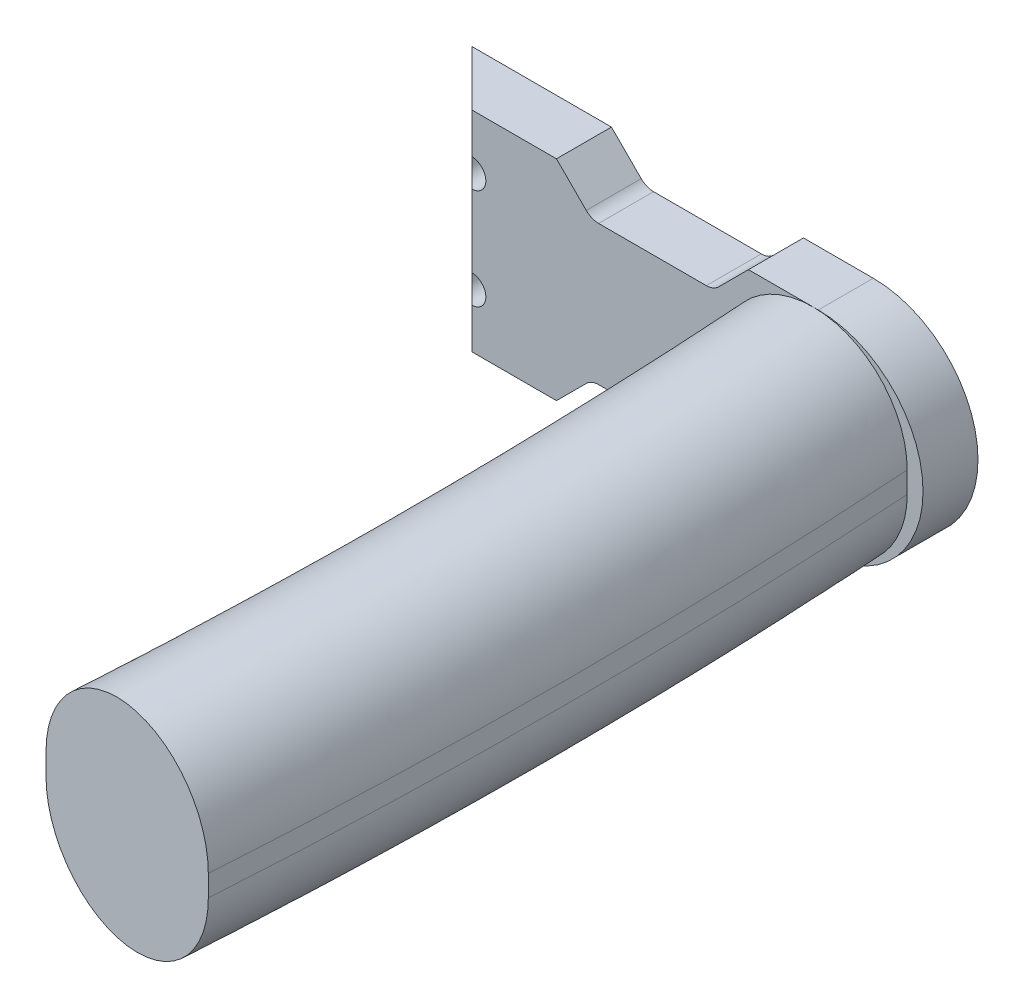
ISO-10303-21;
HEADER;
FILE_DESCRIPTION(('STEP AP214'),'2;1');
FILE_NAME('part.step','',(''),(''),'','','');
FILE_SCHEMA(('AUTOMOTIVE_DESIGN { 1 0 10303 214 1 1 1 1 }'));
ENDSEC;
DATA;
#1=APPLICATION_CONTEXT('core data for automotive mechanical design processes');
#2=APPLICATION_PROTOCOL_DEFINITION('international standard','automotive_design',2000,#1);
#3=PRODUCT_CONTEXT('',#1,'mechanical');
#4=PRODUCT('Part','Part','',(#3));
#5=PRODUCT_RELATED_PRODUCT_CATEGORY('part','',(#4));
#6=PRODUCT_DEFINITION_FORMATION('','',#4);
#7=PRODUCT_DEFINITION_CONTEXT('part definition',#1,'design');
#8=PRODUCT_DEFINITION('design','',#6,#7);
#9=PRODUCT_DEFINITION_SHAPE('','',#8);
#10=(LENGTH_UNIT() NAMED_UNIT(*) SI_UNIT(.MILLI.,.METRE.));
#11=(NAMED_UNIT(*) PLANE_ANGLE_UNIT() SI_UNIT($,.RADIAN.));
#12=(NAMED_UNIT(*) SI_UNIT($,.STERADIAN.) SOLID_ANGLE_UNIT());
#13=UNCERTAINTY_MEASURE_WITH_UNIT(LENGTH_MEASURE(1.E-05),#10,'distance_accuracy_value','');
#14=(GEOMETRIC_REPRESENTATION_CONTEXT(3) GLOBAL_UNCERTAINTY_ASSIGNED_CONTEXT((#13)) GLOBAL_UNIT_ASSIGNED_CONTEXT((#10,
#11,#12)) REPRESENTATION_CONTEXT('',''));
#15=CARTESIAN_POINT('',(0.,0.,0.));
#16=DIRECTION('',(0.,0.,1.));
#17=DIRECTION('',(1.,0.,0.));
#18=AXIS2_PLACEMENT_3D('',#15,#16,#17);
#19=CARTESIAN_POINT('',(33.0651280605346,15.875,10.));
#20=DIRECTION('',(0.,0.,-1.));
#21=DIRECTION('',(-1.,0.,0.));
#22=AXIS2_PLACEMENT_3D('',#19,#20,#21);
#23=PLANE('',#22);
#24=DIRECTION('',(0.,-1.,0.));
#25=VECTOR('',#24,1.);
#26=CARTESIAN_POINT('',(54.9536455693665,-1.92559775382524,10.));
#27=LINE('',#26,#25);
#28=CARTESIAN_POINT('',(54.9536455693666,1.92559775382546,9.99999999999999));
#29=VERTEX_POINT('',#28);
#30=CARTESIAN_POINT('',(54.9536455693666,-1.92559775382524,9.99999999999999));
#31=VERTEX_POINT('',#30);
#32=EDGE_CURVE('E54',#29,#31,#27,.T.);
#33=ORIENTED_EDGE('',*,*,#32,.F.);
#34=CARTESIAN_POINT('',(72.0780478155412,1.92559775382545,10.));
#35=DIRECTION('',(0.,0.,1.));
#36=DIRECTION('',(1.,0.,0.));
#37=AXIS2_PLACEMENT_3D('',#34,#35,#36);
#38=CIRCLE('',#37,17.1244022461747);
#39=CARTESIAN_POINT('',(72.0780478155409,19.0500000000001,10.));
#40=VERTEX_POINT('',#39);
#41=EDGE_CURVE('E11',#40,#29,#38,.T.);
#42=ORIENTED_EDGE('',*,*,#41,.F.);
#43=DIRECTION('',(-1.,0.,0.));
#44=VECTOR('',#43,1.);
#45=CARTESIAN_POINT('',(73.025,19.0500000000001,10.));
#46=LINE('',#45,#44);
#47=CARTESIAN_POINT('',(60.325,19.0499999999999,10.));
#48=VERTEX_POINT('',#47);
#49=EDGE_CURVE('E260',#40,#48,#46,.T.);
#50=ORIENTED_EDGE('',*,*,#49,.T.);
#51=DIRECTION('',(-0.707106781186546,-0.707106781186549,0.));
#52=VECTOR('',#51,1.);
#53=CARTESIAN_POINT('',(54.9049359697328,13.6299359697327,10.));
#54=LINE('',#53,#52);
#55=CARTESIAN_POINT('',(54.9049359697328,13.6299359697327,10.));
#56=VERTEX_POINT('',#55);
#57=EDGE_CURVE('E264',#48,#56,#54,.T.);
#58=ORIENTED_EDGE('',*,*,#57,.T.);
#59=CARTESIAN_POINT('',(52.6598719394655,15.875,10.));
#60=DIRECTION('',(0.,0.,-1.));
#61=DIRECTION('',(-1.,0.,0.));
#62=AXIS2_PLACEMENT_3D('',#59,#60,#61);
#63=CIRCLE('',#62,3.175);
#64=CARTESIAN_POINT('',(52.6598719394655,12.7,10.));
#65=VERTEX_POINT('',#64);
#66=EDGE_CURVE('E266',#56,#65,#63,.T.);
#67=ORIENTED_EDGE('',*,*,#66,.T.);
#68=DIRECTION('',(-1.,0.,0.));
#69=VECTOR('',#68,1.);
#70=CARTESIAN_POINT('',(33.0651280605346,12.7,10.));
#71=LINE('',#70,#69);
#72=CARTESIAN_POINT('',(33.0651280605346,12.7,10.));
#73=VERTEX_POINT('',#72);
#74=EDGE_CURVE('E268',#65,#73,#71,.T.);
#75=ORIENTED_EDGE('',*,*,#74,.T.);
#76=CARTESIAN_POINT('',(33.0651280605346,15.875,10.));
#77=DIRECTION('',(0.,0.,-1.));
#78=DIRECTION('',(-1.,0.,0.));
#79=AXIS2_PLACEMENT_3D('',#76,#77,#78);
#80=CIRCLE('',#79,3.175);
#81=CARTESIAN_POINT('',(30.8200640302673,13.6299359697327,10.));
#82=VERTEX_POINT('',#81);
#83=EDGE_CURVE('E270',#73,#82,#80,.T.);
#84=ORIENTED_EDGE('',*,*,#83,.T.);
#85=DIRECTION('',(-0.70710678118655,0.707106781186545,0.));
#86=VECTOR('',#85,1.);
#87=CARTESIAN_POINT('',(25.4,19.05,10.));
#88=LINE('',#87,#86);
#89=CARTESIAN_POINT('',(25.4,19.05,10.));
#90=VERTEX_POINT('',#89);
#91=EDGE_CURVE('E272',#82,#90,#88,.T.);
#92=ORIENTED_EDGE('',*,*,#91,.T.);
#93=DIRECTION('',(-1.,0.,0.));
#94=VECTOR('',#93,1.);
#95=CARTESIAN_POINT('',(0.,19.05,10.));
#96=LINE('',#95,#94);
#97=CARTESIAN_POINT('',(10.,19.05,10.));
#98=VERTEX_POINT('',#97);
#99=EDGE_CURVE('E274',#90,#98,#96,.T.);
#100=ORIENTED_EDGE('',*,*,#99,.T.);
#101=DIRECTION('',(0.,-1.,0.));
#102=VECTOR('',#101,1.);
#103=CARTESIAN_POINT('',(10.,15.875,10.));
#104=LINE('',#103,#102);
#105=CARTESIAN_POINT('',(10.,11.6967,10.));
#106=VERTEX_POINT('',#105);
#107=EDGE_CURVE('E352',#98,#106,#104,.T.);
#108=ORIENTED_EDGE('',*,*,#107,.T.);
#109=CARTESIAN_POINT('',(10.,9.144,10.));
#110=DIRECTION('',(0.,0.,-1.));
#111=DIRECTION('',(-1.,0.,0.));
#112=AXIS2_PLACEMENT_3D('',#109,#110,#111);
#113=CIRCLE('',#112,2.5527);
#114=CARTESIAN_POINT('',(10.,6.5913,10.));
#115=VERTEX_POINT('',#114);
#116=EDGE_CURVE('E40',#106,#115,#113,.T.);
#117=ORIENTED_EDGE('',*,*,#116,.T.);
#118=CARTESIAN_POINT('',(10.,-6.5913,10.));
#119=VERTEX_POINT('',#118);
#120=EDGE_CURVE('E356',#115,#119,#104,.T.);
#121=ORIENTED_EDGE('',*,*,#120,.T.);
#122=CARTESIAN_POINT('',(10.,-9.144,10.));
#123=DIRECTION('',(0.,0.,-1.));
#124=DIRECTION('',(-1.,0.,0.));
#125=AXIS2_PLACEMENT_3D('',#122,#123,#124);
#126=CIRCLE('',#125,2.5527);
#127=CARTESIAN_POINT('',(10.,-11.6967,10.));
#128=VERTEX_POINT('',#127);
#129=EDGE_CURVE('E231',#119,#128,#126,.T.);
#130=ORIENTED_EDGE('',*,*,#129,.T.);
#131=CARTESIAN_POINT('',(10.,-19.05,10.));
#132=VERTEX_POINT('',#131);
#133=EDGE_CURVE('E351',#128,#132,#104,.T.);
#134=ORIENTED_EDGE('',*,*,#133,.T.);
#135=DIRECTION('',(1.,0.,0.));
#136=VECTOR('',#135,1.);
#137=CARTESIAN_POINT('',(25.4,-19.05,10.));
#138=LINE('',#137,#136);
#139=CARTESIAN_POINT('',(25.4,-19.05,10.));
#140=VERTEX_POINT('',#139);
#141=EDGE_CURVE('E242',#132,#140,#138,.T.);
#142=ORIENTED_EDGE('',*,*,#141,.T.);
#143=DIRECTION('',(0.707106781186548,0.707106781186547,0.));
#144=VECTOR('',#143,1.);
#145=CARTESIAN_POINT('',(30.8200640302673,-13.6299359697327,10.));
#146=LINE('',#145,#144);
#147=CARTESIAN_POINT('',(30.8200640302673,-13.6299359697327,10.));
#148=VERTEX_POINT('',#147);
#149=EDGE_CURVE('E244',#140,#148,#146,.T.);
#150=ORIENTED_EDGE('',*,*,#149,.T.);
#151=CARTESIAN_POINT('',(33.0651280605346,-15.875,10.));
#152=DIRECTION('',(0.,0.,-1.));
#153=DIRECTION('',(1.,0.,0.));
#154=AXIS2_PLACEMENT_3D('',#151,#152,#153);
#155=CIRCLE('',#154,3.175);
#156=CARTESIAN_POINT('',(33.0651280605346,-12.7,10.));
#157=VERTEX_POINT('',#156);
#158=EDGE_CURVE('E247',#148,#157,#155,.T.);
#159=ORIENTED_EDGE('',*,*,#158,.T.);
#160=DIRECTION('',(1.,0.,0.));
#161=VECTOR('',#160,1.);
#162=CARTESIAN_POINT('',(52.6598719394655,-12.7,10.));
#163=LINE('',#162,#161);
#164=CARTESIAN_POINT('',(52.6598719394655,-12.7,10.));
#165=VERTEX_POINT('',#164);
#166=EDGE_CURVE('E249',#157,#165,#163,.T.);
#167=ORIENTED_EDGE('',*,*,#166,.T.);
#168=CARTESIAN_POINT('',(52.6598719394655,-15.875,10.));
#169=DIRECTION('',(0.,0.,-1.));
#170=DIRECTION('',(1.,0.,0.));
#171=AXIS2_PLACEMENT_3D('',#168,#169,#170);
#172=CIRCLE('',#171,3.175);
#173=CARTESIAN_POINT('',(54.9049359697327,-13.6299359697327,10.));
#174=VERTEX_POINT('',#173);
#175=EDGE_CURVE('E251',#165,#174,#172,.T.);
#176=ORIENTED_EDGE('',*,*,#175,.T.);
#177=DIRECTION('',(0.707106781186552,-0.707106781186543,0.));
#178=VECTOR('',#177,1.);
#179=CARTESIAN_POINT('',(54.9049359697327,-13.6299359697327,10.));
#180=LINE('',#179,#178);
#181=CARTESIAN_POINT('',(60.325,-19.0499999999999,10.));
#182=VERTEX_POINT('',#181);
#183=EDGE_CURVE('E253',#174,#182,#180,.T.);
#184=ORIENTED_EDGE('',*,*,#183,.T.);
#185=DIRECTION('',(1.,0.,0.));
#186=VECTOR('',#185,1.);
#187=CARTESIAN_POINT('',(73.025,-19.0499999999999,10.));
#188=LINE('',#187,#186);
#189=CARTESIAN_POINT('',(72.0780478155412,-19.0499999999999,10.));
#190=VERTEX_POINT('',#189);
#191=EDGE_CURVE('E256',#182,#190,#188,.T.);
#192=ORIENTED_EDGE('',*,*,#191,.T.);
#193=CARTESIAN_POINT('',(72.0780478155412,-1.92559775382524,10.));
#194=DIRECTION('',(0.,0.,1.));
#195=DIRECTION('',(1.,0.,0.));
#196=AXIS2_PLACEMENT_3D('',#193,#194,#195);
#197=CIRCLE('',#196,17.1244022461747);
#198=EDGE_CURVE('E58',#31,#190,#197,.T.);
#199=ORIENTED_EDGE('',*,*,#198,.F.);
#200=EDGE_LOOP('',(#33,#42,#50,#58,#67,#75,#84,#92,#100,#108,#117,#121,#130,#134,#142,#150,#159,
#167,#176,#184,#192,#199));
#201=FACE_BOUND('',#200,.T.);
#202=ADVANCED_FACE('F36',(#201),#23,.F.);
#203=CARTESIAN_POINT('',(89.2024500617159,-1.92559775382524,10.));
#204=VERTEX_POINT('',#203);
#205=EDGE_CURVE('E45',#190,#204,#197,.T.);
#206=ORIENTED_EDGE('',*,*,#205,.F.);
#207=CARTESIAN_POINT('',(73.025,-19.0499999999999,10.));
#208=VERTEX_POINT('',#207);
#209=EDGE_CURVE('E255',#190,#208,#188,.T.);
#210=ORIENTED_EDGE('',*,*,#209,.T.);
#211=CARTESIAN_POINT('',(73.025,1.11022302462516E-13,10.));
#212=DIRECTION('',(0.,0.,1.));
#213=DIRECTION('',(1.,0.,0.));
#214=AXIS2_PLACEMENT_3D('',#211,#212,#213);
#215=CIRCLE('',#214,19.05);
#216=CARTESIAN_POINT('',(73.025,19.0500000000001,10.));
#217=VERTEX_POINT('',#216);
#218=EDGE_CURVE('E258',#208,#217,#215,.T.);
#219=ORIENTED_EDGE('',*,*,#218,.T.);
#220=EDGE_CURVE('E261',#217,#40,#46,.T.);
#221=ORIENTED_EDGE('',*,*,#220,.T.);
#222=CARTESIAN_POINT('',(89.2024500617159,1.92559775382545,10.));
#223=VERTEX_POINT('',#222);
#224=EDGE_CURVE('E47',#223,#40,#38,.T.);
#225=ORIENTED_EDGE('',*,*,#224,.F.);
#226=DIRECTION('',(0.,1.,0.));
#227=VECTOR('',#226,1.);
#228=CARTESIAN_POINT('',(89.2024500617158,-1.92559775382524,10.));
#229=LINE('',#228,#227);
#230=EDGE_CURVE('E216',#204,#223,#229,.T.);
#231=ORIENTED_EDGE('',*,*,#230,.F.);
#232=EDGE_LOOP('',(#206,#210,#219,#221,#225,#231));
#233=FACE_BOUND('',#232,.T.);
#234=ADVANCED_FACE('F372',(#233),#23,.F.);
#235=CARTESIAN_POINT('',(25.4,-19.05,10.));
#236=DIRECTION('',(0.,1.,0.));
#237=DIRECTION('',(0.,0.,1.));
#238=AXIS2_PLACEMENT_3D('',#235,#236,#237);
#239=PLANE('',#238);
#240=ORIENTED_EDGE('',*,*,#141,.F.);
#241=DIRECTION('',(0.707106781186546,0.,0.707106781186549));
#242=VECTOR('',#241,1.);
#243=CARTESIAN_POINT('',(10.,-19.05,10.));
#244=LINE('',#243,#242);
#245=CARTESIAN_POINT('',(0.,-19.05,0.));
#246=VERTEX_POINT('',#245);
#247=EDGE_CURVE('E355',#132,#246,#244,.F.);
#248=ORIENTED_EDGE('',*,*,#247,.T.);
#249=DIRECTION('',(1.,0.,0.));
#250=VECTOR('',#249,1.);
#251=CARTESIAN_POINT('',(25.4,-19.05,0.));
#252=LINE('',#251,#250);
#253=CARTESIAN_POINT('',(25.4,-19.05,0.));
#254=VERTEX_POINT('',#253);
#255=EDGE_CURVE('E241',#246,#254,#252,.T.);
#256=ORIENTED_EDGE('',*,*,#255,.T.);
#257=DIRECTION('',(0.,0.,-1.));
#258=VECTOR('',#257,1.);
#259=CARTESIAN_POINT('',(25.4,-19.05,10.));
#260=LINE('',#259,#258);
#261=EDGE_CURVE('E348',#140,#254,#260,.T.);
#262=ORIENTED_EDGE('',*,*,#261,.F.);
#263=EDGE_LOOP('',(#240,#248,#256,#262));
#264=FACE_BOUND('',#263,.T.);
#265=ADVANCED_FACE('F433',(#264),#239,.F.);
#266=CARTESIAN_POINT('',(30.8200640302673,-13.6299359697327,10.));
#267=DIRECTION('',(-0.707106781186547,0.707106781186548,0.));
#268=DIRECTION('',(-0.707106781186548,-0.707106781186547,0.));
#269=AXIS2_PLACEMENT_3D('',#266,#267,#268);
#270=PLANE('',#269);
#271=DIRECTION('',(0.707106781186548,0.707106781186547,0.));
#272=VECTOR('',#271,1.);
#273=CARTESIAN_POINT('',(30.8200640302673,-13.6299359697327,0.));
#274=LINE('',#273,#272);
#275=CARTESIAN_POINT('',(30.8200640302673,-13.6299359697327,0.));
#276=VERTEX_POINT('',#275);
#277=EDGE_CURVE('E280',#254,#276,#274,.T.);
#278=ORIENTED_EDGE('',*,*,#277,.T.);
#279=DIRECTION('',(0.,0.,-1.));
#280=VECTOR('',#279,1.);
#281=CARTESIAN_POINT('',(30.8200640302673,-13.6299359697327,10.));
#282=LINE('',#281,#280);
#283=EDGE_CURVE('E345',#148,#276,#282,.T.);
#284=ORIENTED_EDGE('',*,*,#283,.F.);
#285=ORIENTED_EDGE('',*,*,#149,.F.);
#286=ORIENTED_EDGE('',*,*,#261,.T.);
#287=EDGE_LOOP('',(#278,#284,#285,#286));
#288=FACE_BOUND('',#287,.T.);
#289=ADVANCED_FACE('F437',(#288),#270,.F.);
#290=CARTESIAN_POINT('',(33.0651280605346,-15.875,10.));
#291=DIRECTION('',(0.,0.,-1.));
#292=DIRECTION('',(-1.,0.,0.));
#293=AXIS2_PLACEMENT_3D('',#290,#291,#292);
#294=CYLINDRICAL_SURFACE('',#293,3.175);
#295=CARTESIAN_POINT('',(33.0651280605346,-15.875,0.));
#296=DIRECTION('',(0.,0.,-1.));
#297=DIRECTION('',(1.,0.,0.));
#298=AXIS2_PLACEMENT_3D('',#295,#296,#297);
#299=CIRCLE('',#298,3.175);
#300=CARTESIAN_POINT('',(33.0651280605346,-12.7,0.));
#301=VERTEX_POINT('',#300);
#302=EDGE_CURVE('E282',#276,#301,#299,.T.);
#303=ORIENTED_EDGE('',*,*,#302,.T.);
#304=DIRECTION('',(0.,0.,-1.));
#305=VECTOR('',#304,1.);
#306=CARTESIAN_POINT('',(33.0651280605346,-12.7,10.));
#307=LINE('',#306,#305);
#308=EDGE_CURVE('E342',#157,#301,#307,.T.);
#309=ORIENTED_EDGE('',*,*,#308,.F.);
#310=ORIENTED_EDGE('',*,*,#158,.F.);
#311=ORIENTED_EDGE('',*,*,#283,.T.);
#312=EDGE_LOOP('',(#303,#309,#310,#311));
#313=FACE_BOUND('',#312,.T.);
#314=ADVANCED_FACE('F441',(#313),#294,.F.);
#315=CARTESIAN_POINT('',(52.6598719394655,-12.7,10.));
#316=DIRECTION('',(0.,1.,0.));
#317=DIRECTION('',(-1.,0.,0.));
#318=AXIS2_PLACEMENT_3D('',#315,#316,#317);
#319=PLANE('',#318);
#320=DIRECTION('',(1.,0.,0.));
#321=VECTOR('',#320,1.);
#322=CARTESIAN_POINT('',(52.6598719394655,-12.7,0.));
#323=LINE('',#322,#321);
#324=CARTESIAN_POINT('',(52.6598719394655,-12.7,0.));
#325=VERTEX_POINT('',#324);
#326=EDGE_CURVE('E284',#301,#325,#323,.T.);
#327=ORIENTED_EDGE('',*,*,#326,.T.);
#328=DIRECTION('',(0.,0.,-1.));
#329=VECTOR('',#328,1.);
#330=CARTESIAN_POINT('',(52.6598719394655,-12.7,10.));
#331=LINE('',#330,#329);
#332=EDGE_CURVE('E339',#165,#325,#331,.T.);
#333=ORIENTED_EDGE('',*,*,#332,.F.);
#334=ORIENTED_EDGE('',*,*,#166,.F.);
#335=ORIENTED_EDGE('',*,*,#308,.T.);
#336=EDGE_LOOP('',(#327,#333,#334,#335));
#337=FACE_BOUND('',#336,.T.);
#338=ADVANCED_FACE('F447',(#337),#319,.F.);
#339=CARTESIAN_POINT('',(52.6598719394655,-15.875,10.));
#340=DIRECTION('',(0.,0.,-1.));
#341=DIRECTION('',(-1.,0.,0.));
#342=AXIS2_PLACEMENT_3D('',#339,#340,#341);
#343=CYLINDRICAL_SURFACE('',#342,3.175);
#344=CARTESIAN_POINT('',(52.6598719394655,-15.875,0.));
#345=DIRECTION('',(0.,0.,-1.));
#346=DIRECTION('',(1.,0.,0.));
#347=AXIS2_PLACEMENT_3D('',#344,#345,#346);
#348=CIRCLE('',#347,3.175);
#349=CARTESIAN_POINT('',(54.9049359697327,-13.6299359697327,0.));
#350=VERTEX_POINT('',#349);
#351=EDGE_CURVE('E286',#325,#350,#348,.T.);
#352=ORIENTED_EDGE('',*,*,#351,.T.);
#353=DIRECTION('',(0.,0.,-1.));
#354=VECTOR('',#353,1.);
#355=CARTESIAN_POINT('',(54.9049359697327,-13.6299359697327,10.));
#356=LINE('',#355,#354);
#357=EDGE_CURVE('E336',#174,#350,#356,.T.);
#358=ORIENTED_EDGE('',*,*,#357,.F.);
#359=ORIENTED_EDGE('',*,*,#175,.F.);
#360=ORIENTED_EDGE('',*,*,#332,.T.);
#361=EDGE_LOOP('',(#352,#358,#359,#360));
#362=FACE_BOUND('',#361,.T.);
#363=ADVANCED_FACE('F451',(#362),#343,.F.);
#364=CARTESIAN_POINT('',(54.9049359697327,-13.6299359697327,10.));
#365=DIRECTION('',(0.707106781186543,0.707106781186552,0.));
#366=DIRECTION('',(-0.707106781186552,0.707106781186543,0.));
#367=AXIS2_PLACEMENT_3D('',#364,#365,#366);
#368=PLANE('',#367);
#369=DIRECTION('',(0.707106781186552,-0.707106781186543,0.));
#370=VECTOR('',#369,1.);
#371=CARTESIAN_POINT('',(54.9049359697327,-13.6299359697327,0.));
#372=LINE('',#371,#370);
#373=CARTESIAN_POINT('',(60.325,-19.0499999999999,0.));
#374=VERTEX_POINT('',#373);
#375=EDGE_CURVE('E288',#350,#374,#372,.T.);
#376=ORIENTED_EDGE('',*,*,#375,.T.);
#377=DIRECTION('',(0.,0.,-1.));
#378=VECTOR('',#377,1.);
#379=CARTESIAN_POINT('',(60.325,-19.0499999999999,10.));
#380=LINE('',#379,#378);
#381=EDGE_CURVE('E333',#182,#374,#380,.T.);
#382=ORIENTED_EDGE('',*,*,#381,.F.);
#383=ORIENTED_EDGE('',*,*,#183,.F.);
#384=ORIENTED_EDGE('',*,*,#357,.T.);
#385=EDGE_LOOP('',(#376,#382,#383,#384));
#386=FACE_BOUND('',#385,.T.);
#387=ADVANCED_FACE('F456',(#386),#368,.F.);
#388=CARTESIAN_POINT('',(73.025,-19.0499999999999,10.));
#389=DIRECTION('',(0.,1.,0.));
#390=DIRECTION('',(-1.,0.,0.));
#391=AXIS2_PLACEMENT_3D('',#388,#389,#390);
#392=PLANE('',#391);
#393=DIRECTION('',(1.,0.,0.));
#394=VECTOR('',#393,1.);
#395=CARTESIAN_POINT('',(73.025,-19.0499999999999,0.));
#396=LINE('',#395,#394);
#397=CARTESIAN_POINT('',(73.025,-19.0499999999999,0.));
#398=VERTEX_POINT('',#397);
#399=EDGE_CURVE('E290',#374,#398,#396,.T.);
#400=ORIENTED_EDGE('',*,*,#399,.T.);
#401=DIRECTION('',(0.,0.,-1.));
#402=VECTOR('',#401,1.);
#403=CARTESIAN_POINT('',(73.025,-19.0499999999999,10.));
#404=LINE('',#403,#402);
#405=EDGE_CURVE('E330',#208,#398,#404,.T.);
#406=ORIENTED_EDGE('',*,*,#405,.F.);
#407=ORIENTED_EDGE('',*,*,#209,.F.);
#408=ORIENTED_EDGE('',*,*,#191,.F.);
#409=ORIENTED_EDGE('',*,*,#381,.T.);
#410=EDGE_LOOP('',(#400,#406,#407,#408,#409));
#411=FACE_BOUND('',#410,.T.);
#412=ADVANCED_FACE('F459',(#411),#392,.F.);
#413=CARTESIAN_POINT('',(73.025,1.11022302462516E-13,10.));
#414=DIRECTION('',(0.,0.,-1.));
#415=DIRECTION('',(-1.,0.,0.));
#416=AXIS2_PLACEMENT_3D('',#413,#414,#415);
#417=CYLINDRICAL_SURFACE('',#416,19.05);
#418=CARTESIAN_POINT('',(73.025,1.11022302462516E-13,0.));
#419=DIRECTION('',(0.,0.,1.));
#420=DIRECTION('',(1.,0.,0.));
#421=AXIS2_PLACEMENT_3D('',#418,#419,#420);
#422=CIRCLE('',#421,19.05);
#423=CARTESIAN_POINT('',(73.025,19.0500000000001,0.));
#424=VERTEX_POINT('',#423);
#425=EDGE_CURVE('E292',#398,#424,#422,.T.);
#426=ORIENTED_EDGE('',*,*,#425,.T.);
#427=DIRECTION('',(0.,0.,-1.));
#428=VECTOR('',#427,1.);
#429=CARTESIAN_POINT('',(73.025,19.0500000000001,10.));
#430=LINE('',#429,#428);
#431=EDGE_CURVE('E327',#217,#424,#430,.T.);
#432=ORIENTED_EDGE('',*,*,#431,.F.);
#433=ORIENTED_EDGE('',*,*,#218,.F.);
#434=ORIENTED_EDGE('',*,*,#405,.T.);
#435=EDGE_LOOP('',(#426,#432,#433,#434));
#436=FACE_BOUND('',#435,.T.);
#437=ADVANCED_FACE('F464',(#436),#417,.T.);
#438=CARTESIAN_POINT('',(73.025,19.0500000000001,10.));
#439=DIRECTION('',(0.,-1.,0.));
#440=DIRECTION('',(1.,0.,0.));
#441=AXIS2_PLACEMENT_3D('',#438,#439,#440);
#442=PLANE('',#441);
#443=DIRECTION('',(-1.,0.,0.));
#444=VECTOR('',#443,1.);
#445=CARTESIAN_POINT('',(73.025,19.0500000000001,0.));
#446=LINE('',#445,#444);
#447=CARTESIAN_POINT('',(60.325,19.0499999999999,0.));
#448=VERTEX_POINT('',#447);
#449=EDGE_CURVE('E294',#424,#448,#446,.T.);
#450=ORIENTED_EDGE('',*,*,#449,.T.);
#451=DIRECTION('',(0.,0.,-1.));
#452=VECTOR('',#451,1.);
#453=CARTESIAN_POINT('',(60.325,19.0499999999999,10.));
#454=LINE('',#453,#452);
#455=EDGE_CURVE('E324',#48,#448,#454,.T.);
#456=ORIENTED_EDGE('',*,*,#455,.F.);
#457=ORIENTED_EDGE('',*,*,#49,.F.);
#458=ORIENTED_EDGE('',*,*,#220,.F.);
#459=ORIENTED_EDGE('',*,*,#431,.T.);
#460=EDGE_LOOP('',(#450,#456,#457,#458,#459));
#461=FACE_BOUND('',#460,.T.);
#462=ADVANCED_FACE('F378',(#461),#442,.F.);
#463=CARTESIAN_POINT('',(54.9049359697328,13.6299359697327,10.));
#464=DIRECTION('',(0.707106781186549,-0.707106781186546,0.));
#465=DIRECTION('',(0.707106781186546,0.707106781186549,0.));
#466=AXIS2_PLACEMENT_3D('',#463,#464,#465);
#467=PLANE('',#466);
#468=DIRECTION('',(-0.707106781186546,-0.707106781186549,0.));
#469=VECTOR('',#468,1.);
#470=CARTESIAN_POINT('',(54.9049359697328,13.6299359697327,0.));
#471=LINE('',#470,#469);
#472=CARTESIAN_POINT('',(54.9049359697328,13.6299359697327,0.));
#473=VERTEX_POINT('',#472);
#474=EDGE_CURVE('E296',#448,#473,#471,.T.);
#475=ORIENTED_EDGE('',*,*,#474,.T.);
#476=DIRECTION('',(0.,0.,-1.));
#477=VECTOR('',#476,1.);
#478=CARTESIAN_POINT('',(54.9049359697328,13.6299359697327,10.));
#479=LINE('',#478,#477);
#480=EDGE_CURVE('E321',#56,#473,#479,.T.);
#481=ORIENTED_EDGE('',*,*,#480,.F.);
#482=ORIENTED_EDGE('',*,*,#57,.F.);
#483=ORIENTED_EDGE('',*,*,#455,.T.);
#484=EDGE_LOOP('',(#475,#481,#482,#483));
#485=FACE_BOUND('',#484,.T.);
#486=ADVANCED_FACE('F386',(#485),#467,.F.);
#487=CARTESIAN_POINT('',(52.6598719394655,15.875,10.));
#488=DIRECTION('',(0.,0.,-1.));
#489=DIRECTION('',(-1.,0.,0.));
#490=AXIS2_PLACEMENT_3D('',#487,#488,#489);
#491=CYLINDRICAL_SURFACE('',#490,3.175);
#492=CARTESIAN_POINT('',(52.6598719394655,15.875,0.));
#493=DIRECTION('',(0.,0.,-1.));
#494=DIRECTION('',(-1.,0.,0.));
#495=AXIS2_PLACEMENT_3D('',#492,#493,#494);
#496=CIRCLE('',#495,3.175);
#497=CARTESIAN_POINT('',(52.6598719394655,12.7,0.));
#498=VERTEX_POINT('',#497);
#499=EDGE_CURVE('E298',#473,#498,#496,.T.);
#500=ORIENTED_EDGE('',*,*,#499,.T.);
#501=DIRECTION('',(0.,0.,-1.));
#502=VECTOR('',#501,1.);
#503=CARTESIAN_POINT('',(52.6598719394655,12.7,10.));
#504=LINE('',#503,#502);
#505=EDGE_CURVE('E318',#65,#498,#504,.T.);
#506=ORIENTED_EDGE('',*,*,#505,.F.);
#507=ORIENTED_EDGE('',*,*,#66,.F.);
#508=ORIENTED_EDGE('',*,*,#480,.T.);
#509=EDGE_LOOP('',(#500,#506,#507,#508));
#510=FACE_BOUND('',#509,.T.);
#511=ADVANCED_FACE('F390',(#510),#491,.F.);
#512=CARTESIAN_POINT('',(33.0651280605346,12.7,10.));
#513=DIRECTION('',(0.,-1.,0.));
#514=DIRECTION('',(1.,0.,0.));
#515=AXIS2_PLACEMENT_3D('',#512,#513,#514);
#516=PLANE('',#515);
#517=DIRECTION('',(-1.,0.,0.));
#518=VECTOR('',#517,1.);
#519=CARTESIAN_POINT('',(33.0651280605346,12.7,0.));
#520=LINE('',#519,#518);
#521=CARTESIAN_POINT('',(33.0651280605346,12.7,0.));
#522=VERTEX_POINT('',#521);
#523=EDGE_CURVE('E300',#498,#522,#520,.T.);
#524=ORIENTED_EDGE('',*,*,#523,.T.);
#525=DIRECTION('',(0.,0.,-1.));
#526=VECTOR('',#525,1.);
#527=CARTESIAN_POINT('',(33.0651280605346,12.7,10.));
#528=LINE('',#527,#526);
#529=EDGE_CURVE('E315',#73,#522,#528,.T.);
#530=ORIENTED_EDGE('',*,*,#529,.F.);
#531=ORIENTED_EDGE('',*,*,#74,.F.);
#532=ORIENTED_EDGE('',*,*,#505,.T.);
#533=EDGE_LOOP('',(#524,#530,#531,#532));
#534=FACE_BOUND('',#533,.T.);
#535=ADVANCED_FACE('F395',(#534),#516,.F.);
#536=CARTESIAN_POINT('',(33.0651280605346,15.875,10.));
#537=DIRECTION('',(0.,0.,-1.));
#538=DIRECTION('',(-1.,0.,0.));
#539=AXIS2_PLACEMENT_3D('',#536,#537,#538);
#540=CYLINDRICAL_SURFACE('',#539,3.175);
#541=CARTESIAN_POINT('',(33.0651280605346,15.875,0.));
#542=DIRECTION('',(0.,0.,-1.));
#543=DIRECTION('',(-1.,0.,0.));
#544=AXIS2_PLACEMENT_3D('',#541,#542,#543);
#545=CIRCLE('',#544,3.175);
#546=CARTESIAN_POINT('',(30.8200640302673,13.6299359697327,0.));
#547=VERTEX_POINT('',#546);
#548=EDGE_CURVE('E302',#522,#547,#545,.T.);
#549=ORIENTED_EDGE('',*,*,#548,.T.);
#550=DIRECTION('',(0.,0.,-1.));
#551=VECTOR('',#550,1.);
#552=CARTESIAN_POINT('',(30.8200640302673,13.6299359697327,10.));
#553=LINE('',#552,#551);
#554=EDGE_CURVE('E312',#82,#547,#553,.T.);
#555=ORIENTED_EDGE('',*,*,#554,.F.);
#556=ORIENTED_EDGE('',*,*,#83,.F.);
#557=ORIENTED_EDGE('',*,*,#529,.T.);
#558=EDGE_LOOP('',(#549,#555,#556,#557));
#559=FACE_BOUND('',#558,.T.);
#560=ADVANCED_FACE('F401',(#559),#540,.F.);
#561=CARTESIAN_POINT('',(25.4,19.05,10.));
#562=DIRECTION('',(-0.707106781186545,-0.70710678118655,0.));
#563=DIRECTION('',(0.70710678118655,-0.707106781186545,0.));
#564=AXIS2_PLACEMENT_3D('',#561,#562,#563);
#565=PLANE('',#564);
#566=DIRECTION('',(-0.70710678118655,0.707106781186545,0.));
#567=VECTOR('',#566,1.);
#568=CARTESIAN_POINT('',(25.4,19.05,0.));
#569=LINE('',#568,#567);
#570=CARTESIAN_POINT('',(25.4,19.05,0.));
#571=VERTEX_POINT('',#570);
#572=EDGE_CURVE('E304',#547,#571,#569,.T.);
#573=ORIENTED_EDGE('',*,*,#572,.T.);
#574=DIRECTION('',(0.,0.,-1.));
#575=VECTOR('',#574,1.);
#576=CARTESIAN_POINT('',(25.4,19.05,10.));
#577=LINE('',#576,#575);
#578=EDGE_CURVE('E277',#90,#571,#577,.T.);
#579=ORIENTED_EDGE('',*,*,#578,.F.);
#580=ORIENTED_EDGE('',*,*,#91,.F.);
#581=ORIENTED_EDGE('',*,*,#554,.T.);
#582=EDGE_LOOP('',(#573,#579,#580,#581));
#583=FACE_BOUND('',#582,.T.);
#584=ADVANCED_FACE('F405',(#583),#565,.F.);
#585=CARTESIAN_POINT('',(0.,19.05,10.));
#586=DIRECTION('',(0.,-1.,0.));
#587=DIRECTION('',(0.,0.,-1.));
#588=AXIS2_PLACEMENT_3D('',#585,#586,#587);
#589=PLANE('',#588);
#590=DIRECTION('',(-1.,0.,0.));
#591=VECTOR('',#590,1.);
#592=CARTESIAN_POINT('',(0.,19.05,0.));
#593=LINE('',#592,#591);
#594=CARTESIAN_POINT('',(0.,19.05,0.));
#595=VERTEX_POINT('',#594);
#596=EDGE_CURVE('E306',#571,#595,#593,.T.);
#597=ORIENTED_EDGE('',*,*,#596,.T.);
#598=DIRECTION('',(-0.707106781186546,0.,-0.707106781186549));
#599=VECTOR('',#598,1.);
#600=CARTESIAN_POINT('',(10.,19.05,10.));
#601=LINE('',#600,#599);
#602=EDGE_CURVE('E357',#595,#98,#601,.F.);
#603=ORIENTED_EDGE('',*,*,#602,.T.);
#604=ORIENTED_EDGE('',*,*,#99,.F.);
#605=ORIENTED_EDGE('',*,*,#578,.T.);
#606=EDGE_LOOP('',(#597,#603,#604,#605));
#607=FACE_BOUND('',#606,.T.);
#608=ADVANCED_FACE('F407',(#607),#589,.F.);
#609=CARTESIAN_POINT('',(33.0651280605346,15.875,0.));
#610=DIRECTION('',(0.,0.,-1.));
#611=DIRECTION('',(-1.,0.,0.));
#612=AXIS2_PLACEMENT_3D('',#609,#610,#611);
#613=PLANE('',#612);
#614=CARTESIAN_POINT('',(10.,-9.144,0.));
#615=DIRECTION('',(0.,0.,-1.));
#616=DIRECTION('',(-1.,0.,0.));
#617=AXIS2_PLACEMENT_3D('',#614,#615,#616);
#618=CIRCLE('',#617,2.5527);
#619=CARTESIAN_POINT('',(7.44730000000001,-9.144,0.));
#620=VERTEX_POINT('',#619);
#621=EDGE_CURVE('E202',#620,#620,#618,.T.);
#622=ORIENTED_EDGE('',*,*,#621,.F.);
#623=EDGE_LOOP('',(#622));
#624=FACE_BOUND('',#623,.T.);
#625=CARTESIAN_POINT('',(10.,9.144,0.));
#626=DIRECTION('',(0.,0.,-1.));
#627=DIRECTION('',(-1.,0.,0.));
#628=AXIS2_PLACEMENT_3D('',#625,#626,#627);
#629=CIRCLE('',#628,2.5527);
#630=CARTESIAN_POINT('',(7.44730000000001,9.144,0.));
#631=VERTEX_POINT('',#630);
#632=EDGE_CURVE('E236',#631,#631,#629,.T.);
#633=ORIENTED_EDGE('',*,*,#632,.F.);
#634=EDGE_LOOP('',(#633));
#635=FACE_BOUND('',#634,.T.);
#636=ORIENTED_EDGE('',*,*,#255,.F.);
#637=DIRECTION('',(0.,-1.,0.));
#638=VECTOR('',#637,1.);
#639=CARTESIAN_POINT('',(0.,-19.05,0.));
#640=LINE('',#639,#638);
#641=EDGE_CURVE('E245',#595,#246,#640,.T.);
#642=ORIENTED_EDGE('',*,*,#641,.F.);
#643=ORIENTED_EDGE('',*,*,#596,.F.);
#644=ORIENTED_EDGE('',*,*,#572,.F.);
#645=ORIENTED_EDGE('',*,*,#548,.F.);
#646=ORIENTED_EDGE('',*,*,#523,.F.);
#647=ORIENTED_EDGE('',*,*,#499,.F.);
#648=ORIENTED_EDGE('',*,*,#474,.F.);
#649=ORIENTED_EDGE('',*,*,#449,.F.);
#650=ORIENTED_EDGE('',*,*,#425,.F.);
#651=ORIENTED_EDGE('',*,*,#399,.F.);
#652=ORIENTED_EDGE('',*,*,#375,.F.);
#653=ORIENTED_EDGE('',*,*,#351,.F.);
#654=ORIENTED_EDGE('',*,*,#326,.F.);
#655=ORIENTED_EDGE('',*,*,#302,.F.);
#656=ORIENTED_EDGE('',*,*,#277,.F.);
#657=EDGE_LOOP('',(#636,#642,#643,#644,#645,#646,#647,#648,#649,#650,#651,#652,#653,#654,#655,#656));
#658=FACE_BOUND('',#657,.T.);
#659=ADVANCED_FACE('F420',(#624,#635,#658),#613,.T.);
#660=CARTESIAN_POINT('',(10.,15.875,10.));
#661=DIRECTION('',(0.707106781186549,0.,-0.707106781186546));
#662=DIRECTION('',(0.,-1.,0.));
#663=AXIS2_PLACEMENT_3D('',#660,#661,#662);
#664=PLANE('',#663);
#665=CARTESIAN_POINT('',(10.,-9.144,10.));
#666=DIRECTION('',(0.707106781186549,0.,-0.707106781186546));
#667=DIRECTION('',(-0.707106781186546,0.,-0.707106781186549));
#668=AXIS2_PLACEMENT_3D('',#665,#666,#667);
#669=ELLIPSE('',#668,3.6100629606698,2.5527);
#670=EDGE_CURVE('E234',#119,#128,#669,.F.);
#671=ORIENTED_EDGE('',*,*,#670,.F.);
#672=ORIENTED_EDGE('',*,*,#120,.F.);
#673=CARTESIAN_POINT('',(10.,9.144,10.));
#674=DIRECTION('',(0.707106781186549,0.,-0.707106781186546));
#675=DIRECTION('',(-0.707106781186546,0.,-0.707106781186549));
#676=AXIS2_PLACEMENT_3D('',#673,#674,#675);
#677=ELLIPSE('',#676,3.6100629606698,2.5527);
#678=EDGE_CURVE('E239',#106,#115,#677,.F.);
#679=ORIENTED_EDGE('',*,*,#678,.F.);
#680=ORIENTED_EDGE('',*,*,#107,.F.);
#681=ORIENTED_EDGE('',*,*,#602,.F.);
#682=ORIENTED_EDGE('',*,*,#641,.T.);
#683=ORIENTED_EDGE('',*,*,#247,.F.);
#684=ORIENTED_EDGE('',*,*,#133,.F.);
#685=EDGE_LOOP('',(#671,#672,#679,#680,#681,#682,#683,#684));
#686=FACE_BOUND('',#685,.T.);
#687=ADVANCED_FACE('F38',(#686),#664,.F.);
#688=CARTESIAN_POINT('',(10.,9.144,0.));
#689=DIRECTION('',(0.,0.,-1.));
#690=DIRECTION('',(-1.,0.,0.));
#691=AXIS2_PLACEMENT_3D('',#688,#689,#690);
#692=CYLINDRICAL_SURFACE('',#691,2.5527);
#693=ORIENTED_EDGE('',*,*,#678,.T.);
#694=ORIENTED_EDGE('',*,*,#116,.F.);
#695=EDGE_LOOP('',(#693,#694));
#696=FACE_BOUND('',#695,.T.);
#697=ORIENTED_EDGE('',*,*,#632,.T.);
#698=EDGE_LOOP('',(#697));
#699=FACE_BOUND('',#698,.T.);
#700=ADVANCED_FACE('F413',(#696,#699),#692,.F.);
#701=CARTESIAN_POINT('',(10.,-9.144,0.));
#702=DIRECTION('',(0.,0.,-1.));
#703=DIRECTION('',(-1.,0.,0.));
#704=AXIS2_PLACEMENT_3D('',#701,#702,#703);
#705=CYLINDRICAL_SURFACE('',#704,2.5527);
#706=ORIENTED_EDGE('',*,*,#670,.T.);
#707=ORIENTED_EDGE('',*,*,#129,.F.);
#708=EDGE_LOOP('',(#706,#707));
#709=FACE_BOUND('',#708,.T.);
#710=ORIENTED_EDGE('',*,*,#621,.T.);
#711=EDGE_LOOP('',(#710));
#712=FACE_BOUND('',#711,.T.);
#713=ADVANCED_FACE('F416',(#709,#712),#705,.F.);
#714=CARTESIAN_POINT('',(72.214466710886,-1.92559775382524,134.901855293543));
#715=DIRECTION('',(-0.129490229138664,0.,0.991580697955349));
#716=DIRECTION('',(0.991580697955349,0.,0.129490229138664));
#717=AXIS2_PLACEMENT_3D('',#714,#715,#716);
#718=PLANE('',#717);
#719=CARTESIAN_POINT('',(72.214466710886,-1.92559775382524,134.901855293543));
#720=DIRECTION('',(-0.129490229138664,0.,0.991580697955349));
#721=DIRECTION('',(0.991580697955349,0.,0.129490229138664));
#722=AXIS2_PLACEMENT_3D('',#719,#720,#721);
#723=CIRCLE('',#722,17.1244022461747);
#724=CARTESIAN_POINT('',(55.234239979556,-1.92559775382524,132.684412522823));
#725=VERTEX_POINT('',#724);
#726=CARTESIAN_POINT('',(89.194693442216,-1.92559775382524,137.119298064263));
#727=VERTEX_POINT('',#726);
#728=EDGE_CURVE('E220',#725,#727,#723,.T.);
#729=ORIENTED_EDGE('',*,*,#728,.T.);
#730=DIRECTION('',(0.,1.,0.));
#731=VECTOR('',#730,1.);
#732=CARTESIAN_POINT('',(89.194693442216,-1.92559775382524,137.119298064263));
#733=LINE('',#732,#731);
#734=CARTESIAN_POINT('',(89.194693442216,1.92559775382545,137.119298064263));
#735=VERTEX_POINT('',#734);
#736=EDGE_CURVE('E197',#727,#735,#733,.T.);
#737=ORIENTED_EDGE('',*,*,#736,.T.);
#738=CARTESIAN_POINT('',(72.214466710886,1.92559775382545,134.901855293543));
#739=DIRECTION('',(-0.129490229138664,0.,0.991580697955349));
#740=DIRECTION('',(0.991580697955349,0.,0.129490229138664));
#741=AXIS2_PLACEMENT_3D('',#738,#739,#740);
#742=CIRCLE('',#741,17.1244022461747);
#743=CARTESIAN_POINT('',(55.234239979556,1.92559775382546,132.684412522823));
#744=VERTEX_POINT('',#743);
#745=EDGE_CURVE('E191',#735,#744,#742,.T.);
#746=ORIENTED_EDGE('',*,*,#745,.T.);
#747=DIRECTION('',(0.,-1.,0.));
#748=VECTOR('',#747,1.);
#749=CARTESIAN_POINT('',(55.234239979556,-1.92559775382524,132.684412522823));
#750=LINE('',#749,#748);
#751=EDGE_CURVE('E194',#744,#725,#750,.T.);
#752=ORIENTED_EDGE('',*,*,#751,.T.);
#753=EDGE_LOOP('',(#729,#737,#746,#752));
#754=FACE_BOUND('',#753,.T.);
#755=ADVANCED_FACE('F193',(#754),#718,.T.);
#756=CARTESIAN_POINT('',(-888.359125251238,0.,73.5000000000001));
#757=DIRECTION('',(0.,-1.,0.));
#758=DIRECTION('',(0.,0.,-1.));
#759=AXIS2_PLACEMENT_3D('',#756,#757,#758);
#760=CYLINDRICAL_SURFACE('',#759,945.447636621535);
#761=CARTESIAN_POINT('',(-888.359125251238,-1.92559775382524,73.5000000000001));
#762=DIRECTION('',(0.,-1.,0.));
#763=DIRECTION('',(0.997741952363899,0.,-0.0671639523336387));
#764=AXIS2_PLACEMENT_3D('',#761,#762,#763);
#765=CIRCLE('',#764,945.447636621535);
#766=EDGE_CURVE('E211',#31,#725,#765,.T.);
#767=ORIENTED_EDGE('',*,*,#766,.T.);
#768=ORIENTED_EDGE('',*,*,#751,.F.);
#769=CARTESIAN_POINT('',(-888.359125251238,1.92559775382546,73.5000000000001));
#770=DIRECTION('',(0.,-1.,0.));
#771=DIRECTION('',(0.997741952363899,0.,-0.0671639523336387));
#772=AXIS2_PLACEMENT_3D('',#769,#770,#771);
#773=CIRCLE('',#772,945.447636621535);
#774=EDGE_CURVE('E209',#29,#744,#773,.T.);
#775=ORIENTED_EDGE('',*,*,#774,.F.);
#776=ORIENTED_EDGE('',*,*,#32,.T.);
#777=EDGE_LOOP('',(#767,#768,#775,#776));
#778=FACE_BOUND('',#777,.T.);
#779=ADVANCED_FACE('F208',(#778),#760,.F.);
#780=CARTESIAN_POINT('',(54.9536455693665,-1.92559775382523,10.));
#781=CARTESIAN_POINT('',(57.7041730888472,-1.92559775382523,50.8599643404666));
#782=CARTESIAN_POINT('',(57.7978361270888,-1.92559775382523,91.8122941249232));
#783=CARTESIAN_POINT('',(55.2342399795561,-1.92559775382523,132.684412522823));
#784=CARTESIAN_POINT('',(54.9536455693665,-36.1744022461745,10.));
#785=CARTESIAN_POINT('',(57.7041730888472,-36.1744022461745,50.8599643404666));
#786=CARTESIAN_POINT('',(57.7978361270888,-36.1744022461745,91.8122941249232));
#787=CARTESIAN_POINT('',(55.2342399795561,-36.1744022461745,132.684412522823));
#788=CARTESIAN_POINT('',(89.2024500617158,-36.1744022461745,10.));
#789=CARTESIAN_POINT('',(91.9529775811965,-36.1744022461745,52.3434648013409));
#790=CARTESIAN_POINT('',(91.9503884043547,-36.1744022461745,94.7761692439519));
#791=CARTESIAN_POINT('',(89.1946934422162,-36.1744022461745,137.119298064263));
#792=CARTESIAN_POINT('',(89.2024500617158,-1.92559775382524,10.));
#793=CARTESIAN_POINT('',(91.9529775811965,-1.92559775382524,52.3434648013409));
#794=CARTESIAN_POINT('',(91.9503884043547,-1.92559775382524,94.7761692439519));
#795=CARTESIAN_POINT('',(89.1946934422162,-1.92559775382524,137.119298064263));
#796=(BOUNDED_SURFACE() B_SPLINE_SURFACE(3,3,((#780,#781,#782,#783),(#784,#785,#786,#787),(#788,
#789,#790,#791),(#792,#793,#794,#795)),.UNSPECIFIED.,.F.,.F.,
.F.) B_SPLINE_SURFACE_WITH_KNOTS((4,4),(4,4),(0.,1.),(0.,1.),
.UNSPECIFIED.) GEOMETRIC_REPRESENTATION_ITEM() RATIONAL_B_SPLINE_SURFACE(((1.,0.998595303112549,
0.998595303112549,1.),(0.333333333333333,0.332865101037516,0.332865101037516,0.333333333333333),
(0.333333333333333,0.332865101037516,0.332865101037516,0.333333333333333),(1.,0.998595303112549,
0.998595303112549,1.))) REPRESENTATION_ITEM('') SURFACE());
#797=CARTESIAN_POINT('',(-888.359125251238,-1.92559775382524,73.5000000000001));
#798=DIRECTION('',(0.,-1.,0.));
#799=DIRECTION('',(0.99789691179787,0.,-0.064820933534421));
#800=AXIS2_PLACEMENT_3D('',#797,#798,#799);
#801=CIRCLE('',#800,979.621806376494);
#802=EDGE_CURVE('E222',#204,#727,#801,.T.);
#803=ORIENTED_EDGE('',*,*,#802,.T.);
#804=ORIENTED_EDGE('',*,*,#728,.F.);
#805=ORIENTED_EDGE('',*,*,#766,.F.);
#806=ORIENTED_EDGE('',*,*,#198,.T.);
#807=ORIENTED_EDGE('',*,*,#205,.T.);
#808=EDGE_LOOP('',(#803,#804,#805,#806,#807));
#809=FACE_BOUND('',#808,.T.);
#810=ADVANCED_FACE('F367',(#809),#796,.T.);
#811=CARTESIAN_POINT('',(-888.359125251238,0.,73.5000000000001));
#812=DIRECTION('',(0.,-1.,0.));
#813=DIRECTION('',(0.,0.,-1.));
#814=AXIS2_PLACEMENT_3D('',#811,#812,#813);
#815=CYLINDRICAL_SURFACE('',#814,979.621806376494);
#816=CARTESIAN_POINT('',(-888.359125251238,1.92559775382545,73.5000000000001));
#817=DIRECTION('',(0.,-1.,0.));
#818=DIRECTION('',(0.99789691179787,0.,-0.064820933534421));
#819=AXIS2_PLACEMENT_3D('',#816,#817,#818);
#820=CIRCLE('',#819,979.621806376494);
#821=EDGE_CURVE('E203',#223,#735,#820,.T.);
#822=ORIENTED_EDGE('',*,*,#821,.T.);
#823=ORIENTED_EDGE('',*,*,#736,.F.);
#824=ORIENTED_EDGE('',*,*,#802,.F.);
#825=ORIENTED_EDGE('',*,*,#230,.T.);
#826=EDGE_LOOP('',(#822,#823,#824,#825));
#827=FACE_BOUND('',#826,.T.);
#828=ADVANCED_FACE('F371',(#827),#815,.T.);
#829=CARTESIAN_POINT('',(89.2024500617158,1.92559775382545,10.));
#830=CARTESIAN_POINT('',(91.9529775811965,1.92559775382545,52.3434648013409));
#831=CARTESIAN_POINT('',(91.9503884043547,1.92559775382545,94.7761692439519));
#832=CARTESIAN_POINT('',(89.1946934422162,1.92559775382545,137.119298064263));
#833=CARTESIAN_POINT('',(89.2024500617158,36.1744022461748,10.));
#834=CARTESIAN_POINT('',(91.9529775811965,36.1744022461748,52.3434648013409));
#835=CARTESIAN_POINT('',(91.9503884043547,36.1744022461748,94.7761692439519));
#836=CARTESIAN_POINT('',(89.1946934422162,36.1744022461748,137.119298064263));
#837=CARTESIAN_POINT('',(54.9536455693665,36.1744022461748,10.));
#838=CARTESIAN_POINT('',(57.7041730888472,36.1744022461748,50.8599643404666));
#839=CARTESIAN_POINT('',(57.7978361270888,36.1744022461748,91.8122941249232));
#840=CARTESIAN_POINT('',(55.2342399795562,36.1744022461748,132.684412522823));
#841=CARTESIAN_POINT('',(54.9536455693665,1.92559775382546,10.));
#842=CARTESIAN_POINT('',(57.7041730888472,1.92559775382546,50.8599643404666));
#843=CARTESIAN_POINT('',(57.7978361270888,1.92559775382546,91.8122941249232));
#844=CARTESIAN_POINT('',(55.2342399795561,1.92559775382546,132.684412522823));
#845=(BOUNDED_SURFACE() B_SPLINE_SURFACE(3,3,((#829,#830,#831,#832),(#833,#834,#835,#836),(#837,
#838,#839,#840),(#841,#842,#843,#844)),.UNSPECIFIED.,.F.,.F.,
.F.) B_SPLINE_SURFACE_WITH_KNOTS((4,4),(4,4),(0.,1.),(0.,1.),
.UNSPECIFIED.) GEOMETRIC_REPRESENTATION_ITEM() RATIONAL_B_SPLINE_SURFACE(((1.,0.998595303112549,
0.998595303112549,1.),(0.333333333333333,0.332865101037516,0.332865101037516,0.333333333333333),
(0.333333333333333,0.332865101037516,0.332865101037516,0.333333333333333),(1.,0.998595303112549,
0.998595303112549,1.))) REPRESENTATION_ITEM('') SURFACE());
#846=ORIENTED_EDGE('',*,*,#745,.F.);
#847=ORIENTED_EDGE('',*,*,#821,.F.);
#848=ORIENTED_EDGE('',*,*,#224,.T.);
#849=ORIENTED_EDGE('',*,*,#41,.T.);
#850=ORIENTED_EDGE('',*,*,#774,.T.);
#851=EDGE_LOOP('',(#846,#847,#848,#849,#850));
#852=FACE_BOUND('',#851,.T.);
#853=ADVANCED_FACE('F213',(#852),#845,.T.);
#854=CLOSED_SHELL('',(#202,#234,#265,#289,#314,#338,#363,#387,#412,#437,#462,#486,#511,#535,
#560,#584,#608,#659,#687,#700,#713,#755,#779,#810,#828,#853));
#855=MANIFOLD_SOLID_BREP('B2',#854);
#856=ADVANCED_BREP_SHAPE_REPRESENTATION('',(#18,#855),#14);
#857=SHAPE_DEFINITION_REPRESENTATION(#9,#856);
ENDSEC;
END-ISO-10303-21;
